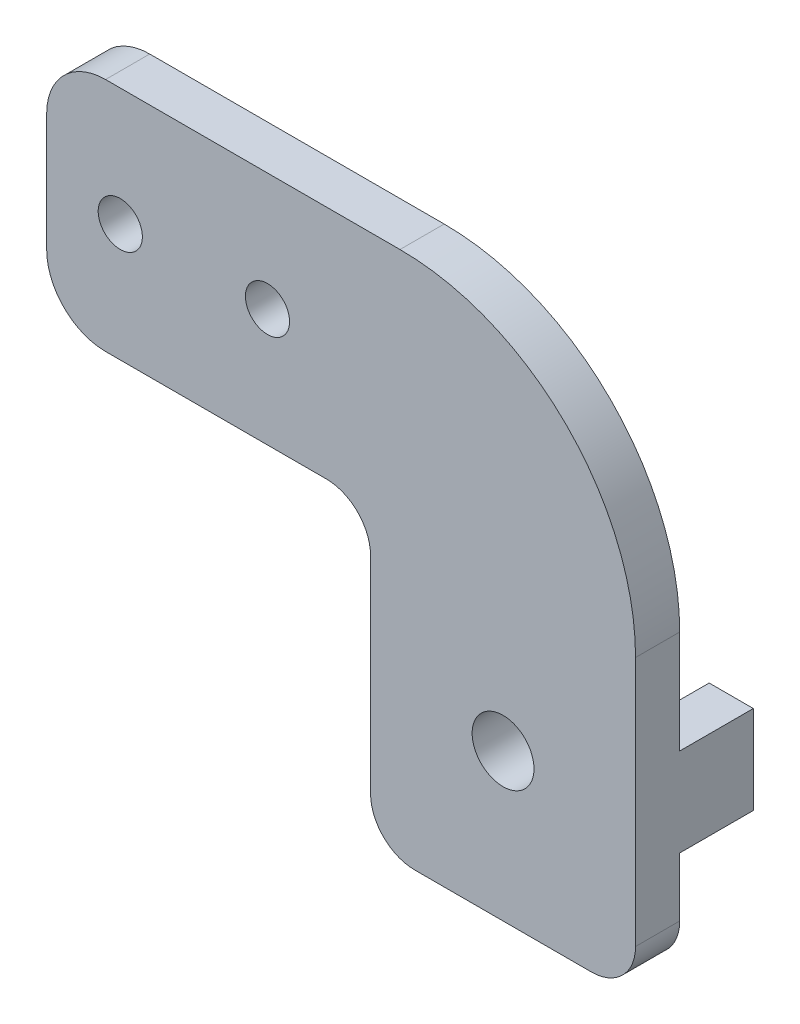
ISO-10303-21;
HEADER;
FILE_DESCRIPTION(('STEP AP214'),'2;1');
FILE_NAME('part.step','',(''),(''),'','','');
FILE_SCHEMA(('AUTOMOTIVE_DESIGN { 1 0 10303 214 1 1 1 1 }'));
ENDSEC;
DATA;
#1=APPLICATION_CONTEXT('core data for automotive mechanical design processes');
#2=APPLICATION_PROTOCOL_DEFINITION('international standard','automotive_design',2000,#1);
#3=PRODUCT_CONTEXT('',#1,'mechanical');
#4=PRODUCT('Part','Part','',(#3));
#5=PRODUCT_RELATED_PRODUCT_CATEGORY('part','',(#4));
#6=PRODUCT_DEFINITION_FORMATION('','',#4);
#7=PRODUCT_DEFINITION_CONTEXT('part definition',#1,'design');
#8=PRODUCT_DEFINITION('design','',#6,#7);
#9=PRODUCT_DEFINITION_SHAPE('','',#8);
#10=(LENGTH_UNIT() NAMED_UNIT(*) SI_UNIT(.MILLI.,.METRE.));
#11=(NAMED_UNIT(*) PLANE_ANGLE_UNIT() SI_UNIT($,.RADIAN.));
#12=(NAMED_UNIT(*) SI_UNIT($,.STERADIAN.) SOLID_ANGLE_UNIT());
#13=UNCERTAINTY_MEASURE_WITH_UNIT(LENGTH_MEASURE(1.E-05),#10,'distance_accuracy_value','');
#14=(GEOMETRIC_REPRESENTATION_CONTEXT(3) GLOBAL_UNCERTAINTY_ASSIGNED_CONTEXT((#13)) GLOBAL_UNIT_ASSIGNED_CONTEXT((#10,
#11,#12)) REPRESENTATION_CONTEXT('',''));
#15=CARTESIAN_POINT('',(0.,0.,0.));
#16=DIRECTION('',(0.,0.,1.));
#17=DIRECTION('',(1.,0.,0.));
#18=AXIS2_PLACEMENT_3D('',#15,#16,#17);
#19=CARTESIAN_POINT('',(44.,0.,3.));
#20=DIRECTION('',(1.,0.,0.));
#21=DIRECTION('',(0.,1.,0.));
#22=AXIS2_PLACEMENT_3D('',#19,#20,#21);
#23=PLANE('',#22);
#24=DIRECTION('',(0.,-1.,0.));
#25=VECTOR('',#24,1.);
#26=CARTESIAN_POINT('',(44.,0.,0.));
#27=LINE('',#26,#25);
#28=CARTESIAN_POINT('',(44.,20.,0.));
#29=VERTEX_POINT('',#28);
#30=CARTESIAN_POINT('',(44.,13.,0.));
#31=VERTEX_POINT('',#30);
#32=EDGE_CURVE('E299',#29,#31,#27,.T.);
#33=ORIENTED_EDGE('',*,*,#32,.F.);
#34=DIRECTION('',(0.,0.,-1.));
#35=VECTOR('',#34,1.);
#36=CARTESIAN_POINT('',(44.,20.,3.));
#37=LINE('',#36,#35);
#38=CARTESIAN_POINT('',(44.,20.,3.));
#39=VERTEX_POINT('',#38);
#40=EDGE_CURVE('E11',#39,#29,#37,.T.);
#41=ORIENTED_EDGE('',*,*,#40,.F.);
#42=DIRECTION('',(0.,-1.,0.));
#43=VECTOR('',#42,1.);
#44=CARTESIAN_POINT('',(44.,0.,3.));
#45=LINE('',#44,#43);
#46=CARTESIAN_POINT('',(44.,3.,3.));
#47=VERTEX_POINT('',#46);
#48=EDGE_CURVE('E251',#39,#47,#45,.T.);
#49=ORIENTED_EDGE('',*,*,#48,.T.);
#50=DIRECTION('',(0.,0.,-1.));
#51=VECTOR('',#50,1.);
#52=CARTESIAN_POINT('',(44.,3.,3.));
#53=LINE('',#52,#51);
#54=CARTESIAN_POINT('',(44.,3.,0.));
#55=VERTEX_POINT('',#54);
#56=EDGE_CURVE('E293',#47,#55,#53,.T.);
#57=ORIENTED_EDGE('',*,*,#56,.T.);
#58=CARTESIAN_POINT('',(44.,7.,0.));
#59=VERTEX_POINT('',#58);
#60=EDGE_CURVE('E232',#59,#55,#27,.T.);
#61=ORIENTED_EDGE('',*,*,#60,.F.);
#62=DIRECTION('',(0.,0.,1.));
#63=VECTOR('',#62,1.);
#64=CARTESIAN_POINT('',(44.,7.,-5.));
#65=LINE('',#64,#63);
#66=CARTESIAN_POINT('',(44.,7.,-5.));
#67=VERTEX_POINT('',#66);
#68=EDGE_CURVE('E238',#67,#59,#65,.T.);
#69=ORIENTED_EDGE('',*,*,#68,.F.);
#70=DIRECTION('',(0.,-1.,0.));
#71=VECTOR('',#70,1.);
#72=CARTESIAN_POINT('',(44.,0.,-5.));
#73=LINE('',#72,#71);
#74=CARTESIAN_POINT('',(44.,13.,-5.));
#75=VERTEX_POINT('',#74);
#76=EDGE_CURVE('E217',#75,#67,#73,.T.);
#77=ORIENTED_EDGE('',*,*,#76,.F.);
#78=DIRECTION('',(0.,0.,1.));
#79=VECTOR('',#78,1.);
#80=CARTESIAN_POINT('',(44.,13.,-5.));
#81=LINE('',#80,#79);
#82=EDGE_CURVE('E235',#75,#31,#81,.T.);
#83=ORIENTED_EDGE('',*,*,#82,.T.);
#84=EDGE_LOOP('',(#33,#41,#49,#57,#61,#69,#77,#83));
#85=FACE_BOUND('',#84,.T.);
#86=ADVANCED_FACE('F37',(#85),#23,.T.);
#87=CARTESIAN_POINT('',(28.,20.,3.));
#88=DIRECTION('',(0.,0.,-1.));
#89=DIRECTION('',(-1.,0.,0.));
#90=AXIS2_PLACEMENT_3D('',#87,#88,#89);
#91=CYLINDRICAL_SURFACE('',#90,16.);
#92=CARTESIAN_POINT('',(28.,20.,0.));
#93=DIRECTION('',(0.,0.,1.));
#94=DIRECTION('',(1.,0.,0.));
#95=AXIS2_PLACEMENT_3D('',#92,#93,#94);
#96=CIRCLE('',#95,16.);
#97=CARTESIAN_POINT('',(28.,36.,0.));
#98=VERTEX_POINT('',#97);
#99=EDGE_CURVE('E296',#98,#29,#96,.F.);
#100=ORIENTED_EDGE('',*,*,#99,.F.);
#101=DIRECTION('',(0.,0.,-1.));
#102=VECTOR('',#101,1.);
#103=CARTESIAN_POINT('',(28.,36.,3.));
#104=LINE('',#103,#102);
#105=CARTESIAN_POINT('',(28.,36.,3.));
#106=VERTEX_POINT('',#105);
#107=EDGE_CURVE('E45',#106,#98,#104,.T.);
#108=ORIENTED_EDGE('',*,*,#107,.F.);
#109=CARTESIAN_POINT('',(28.,20.,3.));
#110=DIRECTION('',(0.,0.,1.));
#111=DIRECTION('',(1.,0.,0.));
#112=AXIS2_PLACEMENT_3D('',#109,#110,#111);
#113=CIRCLE('',#112,16.);
#114=EDGE_CURVE('E254',#106,#39,#113,.F.);
#115=ORIENTED_EDGE('',*,*,#114,.T.);
#116=ORIENTED_EDGE('',*,*,#40,.T.);
#117=EDGE_LOOP('',(#100,#108,#115,#116));
#118=FACE_BOUND('',#117,.T.);
#119=ADVANCED_FACE('F367',(#118),#91,.T.);
#120=CARTESIAN_POINT('',(0.,36.,3.));
#121=DIRECTION('',(0.,1.,0.));
#122=DIRECTION('',(-1.,0.,0.));
#123=AXIS2_PLACEMENT_3D('',#120,#121,#122);
#124=PLANE('',#123);
#125=DIRECTION('',(1.,0.,0.));
#126=VECTOR('',#125,1.);
#127=CARTESIAN_POINT('',(0.,36.,0.));
#128=LINE('',#127,#126);
#129=CARTESIAN_POINT('',(8.,36.,0.));
#130=VERTEX_POINT('',#129);
#131=EDGE_CURVE('E357',#130,#98,#128,.T.);
#132=ORIENTED_EDGE('',*,*,#131,.F.);
#133=DIRECTION('',(0.,0.,-1.));
#134=VECTOR('',#133,1.);
#135=CARTESIAN_POINT('',(8.,36.,3.));
#136=LINE('',#135,#134);
#137=CARTESIAN_POINT('',(8.,36.,3.));
#138=VERTEX_POINT('',#137);
#139=EDGE_CURVE('E302',#138,#130,#136,.T.);
#140=ORIENTED_EDGE('',*,*,#139,.F.);
#141=DIRECTION('',(1.,0.,0.));
#142=VECTOR('',#141,1.);
#143=CARTESIAN_POINT('',(0.,36.,3.));
#144=LINE('',#143,#142);
#145=EDGE_CURVE('E258',#138,#106,#144,.T.);
#146=ORIENTED_EDGE('',*,*,#145,.T.);
#147=ORIENTED_EDGE('',*,*,#107,.T.);
#148=EDGE_LOOP('',(#132,#140,#146,#147));
#149=FACE_BOUND('',#148,.T.);
#150=ADVANCED_FACE('F413',(#149),#124,.T.);
#151=CARTESIAN_POINT('',(8.,32.,3.));
#152=DIRECTION('',(0.,0.,-1.));
#153=DIRECTION('',(-1.,0.,0.));
#154=AXIS2_PLACEMENT_3D('',#151,#152,#153);
#155=CYLINDRICAL_SURFACE('',#154,4.);
#156=CARTESIAN_POINT('',(8.,32.,0.));
#157=DIRECTION('',(0.,0.,1.));
#158=DIRECTION('',(1.,0.,0.));
#159=AXIS2_PLACEMENT_3D('',#156,#157,#158);
#160=CIRCLE('',#159,4.);
#161=CARTESIAN_POINT('',(4.,32.,0.));
#162=VERTEX_POINT('',#161);
#163=EDGE_CURVE('E355',#130,#162,#160,.T.);
#164=ORIENTED_EDGE('',*,*,#163,.T.);
#165=DIRECTION('',(0.,0.,-1.));
#166=VECTOR('',#165,1.);
#167=CARTESIAN_POINT('',(4.,32.,3.));
#168=LINE('',#167,#166);
#169=CARTESIAN_POINT('',(4.,32.,3.));
#170=VERTEX_POINT('',#169);
#171=EDGE_CURVE('E304',#170,#162,#168,.T.);
#172=ORIENTED_EDGE('',*,*,#171,.F.);
#173=CARTESIAN_POINT('',(8.,32.,3.));
#174=DIRECTION('',(0.,0.,1.));
#175=DIRECTION('',(1.,0.,0.));
#176=AXIS2_PLACEMENT_3D('',#173,#174,#175);
#177=CIRCLE('',#176,4.);
#178=EDGE_CURVE('E261',#138,#170,#177,.T.);
#179=ORIENTED_EDGE('',*,*,#178,.F.);
#180=ORIENTED_EDGE('',*,*,#139,.T.);
#181=EDGE_LOOP('',(#164,#172,#179,#180));
#182=FACE_BOUND('',#181,.T.);
#183=ADVANCED_FACE('F417',(#182),#155,.T.);
#184=CARTESIAN_POINT('',(4.,0.,3.));
#185=DIRECTION('',(-1.,0.,0.));
#186=DIRECTION('',(0.,0.,1.));
#187=AXIS2_PLACEMENT_3D('',#184,#185,#186);
#188=PLANE('',#187);
#189=DIRECTION('',(0.,1.,0.));
#190=VECTOR('',#189,1.);
#191=CARTESIAN_POINT('',(4.,0.,0.));
#192=LINE('',#191,#190);
#193=CARTESIAN_POINT('',(4.,24.,0.));
#194=VERTEX_POINT('',#193);
#195=EDGE_CURVE('E352',#194,#162,#192,.T.);
#196=ORIENTED_EDGE('',*,*,#195,.F.);
#197=DIRECTION('',(0.,0.,-1.));
#198=VECTOR('',#197,1.);
#199=CARTESIAN_POINT('',(4.,24.,3.));
#200=LINE('',#199,#198);
#201=CARTESIAN_POINT('',(4.,24.,3.));
#202=VERTEX_POINT('',#201);
#203=EDGE_CURVE('E306',#202,#194,#200,.T.);
#204=ORIENTED_EDGE('',*,*,#203,.F.);
#205=DIRECTION('',(0.,1.,0.));
#206=VECTOR('',#205,1.);
#207=CARTESIAN_POINT('',(4.,0.,3.));
#208=LINE('',#207,#206);
#209=EDGE_CURVE('E263',#202,#170,#208,.T.);
#210=ORIENTED_EDGE('',*,*,#209,.T.);
#211=ORIENTED_EDGE('',*,*,#171,.T.);
#212=EDGE_LOOP('',(#196,#204,#210,#211));
#213=FACE_BOUND('',#212,.T.);
#214=ADVANCED_FACE('F423',(#213),#188,.T.);
#215=CARTESIAN_POINT('',(8.,24.,3.));
#216=DIRECTION('',(0.,0.,-1.));
#217=DIRECTION('',(-1.,0.,0.));
#218=AXIS2_PLACEMENT_3D('',#215,#216,#217);
#219=CYLINDRICAL_SURFACE('',#218,4.);
#220=CARTESIAN_POINT('',(8.,24.,0.));
#221=DIRECTION('',(0.,0.,1.));
#222=DIRECTION('',(1.,0.,0.));
#223=AXIS2_PLACEMENT_3D('',#220,#221,#222);
#224=CIRCLE('',#223,4.);
#225=CARTESIAN_POINT('',(8.,20.,0.));
#226=VERTEX_POINT('',#225);
#227=EDGE_CURVE('E349',#226,#194,#224,.F.);
#228=ORIENTED_EDGE('',*,*,#227,.F.);
#229=DIRECTION('',(0.,0.,-1.));
#230=VECTOR('',#229,1.);
#231=CARTESIAN_POINT('',(8.,20.,3.));
#232=LINE('',#231,#230);
#233=CARTESIAN_POINT('',(8.,20.,3.));
#234=VERTEX_POINT('',#233);
#235=EDGE_CURVE('E308',#234,#226,#232,.T.);
#236=ORIENTED_EDGE('',*,*,#235,.F.);
#237=CARTESIAN_POINT('',(8.,24.,3.));
#238=DIRECTION('',(0.,0.,1.));
#239=DIRECTION('',(1.,0.,0.));
#240=AXIS2_PLACEMENT_3D('',#237,#238,#239);
#241=CIRCLE('',#240,4.);
#242=EDGE_CURVE('E266',#234,#202,#241,.F.);
#243=ORIENTED_EDGE('',*,*,#242,.T.);
#244=ORIENTED_EDGE('',*,*,#203,.T.);
#245=EDGE_LOOP('',(#228,#236,#243,#244));
#246=FACE_BOUND('',#245,.T.);
#247=ADVANCED_FACE('F427',(#246),#219,.T.);
#248=CARTESIAN_POINT('',(0.,20.,3.));
#249=DIRECTION('',(0.,-1.,0.));
#250=DIRECTION('',(1.,0.,0.));
#251=AXIS2_PLACEMENT_3D('',#248,#249,#250);
#252=PLANE('',#251);
#253=DIRECTION('',(-1.,0.,0.));
#254=VECTOR('',#253,1.);
#255=CARTESIAN_POINT('',(0.,20.,0.));
#256=LINE('',#255,#254);
#257=CARTESIAN_POINT('',(23.,20.,0.));
#258=VERTEX_POINT('',#257);
#259=EDGE_CURVE('E346',#258,#226,#256,.T.);
#260=ORIENTED_EDGE('',*,*,#259,.F.);
#261=DIRECTION('',(0.,0.,-1.));
#262=VECTOR('',#261,1.);
#263=CARTESIAN_POINT('',(23.,20.,3.));
#264=LINE('',#263,#262);
#265=CARTESIAN_POINT('',(23.,20.,3.));
#266=VERTEX_POINT('',#265);
#267=EDGE_CURVE('E310',#266,#258,#264,.T.);
#268=ORIENTED_EDGE('',*,*,#267,.F.);
#269=DIRECTION('',(-1.,0.,0.));
#270=VECTOR('',#269,1.);
#271=CARTESIAN_POINT('',(0.,20.,3.));
#272=LINE('',#271,#270);
#273=EDGE_CURVE('E269',#266,#234,#272,.T.);
#274=ORIENTED_EDGE('',*,*,#273,.T.);
#275=ORIENTED_EDGE('',*,*,#235,.T.);
#276=EDGE_LOOP('',(#260,#268,#274,#275));
#277=FACE_BOUND('',#276,.T.);
#278=ADVANCED_FACE('F431',(#277),#252,.T.);
#279=CARTESIAN_POINT('',(23.,17.,3.));
#280=DIRECTION('',(0.,0.,-1.));
#281=DIRECTION('',(-1.,0.,0.));
#282=AXIS2_PLACEMENT_3D('',#279,#280,#281);
#283=CYLINDRICAL_SURFACE('',#282,3.);
#284=CARTESIAN_POINT('',(23.,17.,0.));
#285=DIRECTION('',(0.,0.,1.));
#286=DIRECTION('',(1.,0.,0.));
#287=AXIS2_PLACEMENT_3D('',#284,#285,#286);
#288=CIRCLE('',#287,3.);
#289=CARTESIAN_POINT('',(26.,17.,0.));
#290=VERTEX_POINT('',#289);
#291=EDGE_CURVE('E343',#258,#290,#288,.F.);
#292=ORIENTED_EDGE('',*,*,#291,.T.);
#293=DIRECTION('',(0.,0.,-1.));
#294=VECTOR('',#293,1.);
#295=CARTESIAN_POINT('',(26.,17.,3.));
#296=LINE('',#295,#294);
#297=CARTESIAN_POINT('',(26.,17.,3.));
#298=VERTEX_POINT('',#297);
#299=EDGE_CURVE('E312',#298,#290,#296,.T.);
#300=ORIENTED_EDGE('',*,*,#299,.F.);
#301=CARTESIAN_POINT('',(23.,17.,3.));
#302=DIRECTION('',(0.,0.,1.));
#303=DIRECTION('',(1.,0.,0.));
#304=AXIS2_PLACEMENT_3D('',#301,#302,#303);
#305=CIRCLE('',#304,3.);
#306=EDGE_CURVE('E272',#266,#298,#305,.F.);
#307=ORIENTED_EDGE('',*,*,#306,.F.);
#308=ORIENTED_EDGE('',*,*,#267,.T.);
#309=EDGE_LOOP('',(#292,#300,#307,#308));
#310=FACE_BOUND('',#309,.T.);
#311=ADVANCED_FACE('F435',(#310),#283,.F.);
#312=CARTESIAN_POINT('',(26.,0.,3.));
#313=DIRECTION('',(-1.,0.,0.));
#314=DIRECTION('',(0.,0.,1.));
#315=AXIS2_PLACEMENT_3D('',#312,#313,#314);
#316=PLANE('',#315);
#317=DIRECTION('',(0.,1.,0.));
#318=VECTOR('',#317,1.);
#319=CARTESIAN_POINT('',(26.,0.,0.));
#320=LINE('',#319,#318);
#321=CARTESIAN_POINT('',(26.,3.,0.));
#322=VERTEX_POINT('',#321);
#323=CARTESIAN_POINT('',(26.,7.,0.));
#324=VERTEX_POINT('',#323);
#325=EDGE_CURVE('E340',#322,#324,#320,.T.);
#326=ORIENTED_EDGE('',*,*,#325,.F.);
#327=DIRECTION('',(0.,0.,-1.));
#328=VECTOR('',#327,1.);
#329=CARTESIAN_POINT('',(26.,3.,3.));
#330=LINE('',#329,#328);
#331=CARTESIAN_POINT('',(26.,3.,3.));
#332=VERTEX_POINT('',#331);
#333=EDGE_CURVE('E315',#332,#322,#330,.T.);
#334=ORIENTED_EDGE('',*,*,#333,.F.);
#335=DIRECTION('',(0.,1.,0.));
#336=VECTOR('',#335,1.);
#337=CARTESIAN_POINT('',(26.,0.,3.));
#338=LINE('',#337,#336);
#339=EDGE_CURVE('E274',#332,#298,#338,.T.);
#340=ORIENTED_EDGE('',*,*,#339,.T.);
#341=ORIENTED_EDGE('',*,*,#299,.T.);
#342=CARTESIAN_POINT('',(26.,13.,0.));
#343=VERTEX_POINT('',#342);
#344=EDGE_CURVE('E342',#343,#290,#320,.T.);
#345=ORIENTED_EDGE('',*,*,#344,.F.);
#346=DIRECTION('',(0.,0.,1.));
#347=VECTOR('',#346,1.);
#348=CARTESIAN_POINT('',(26.,13.,-5.));
#349=LINE('',#348,#347);
#350=CARTESIAN_POINT('',(26.,13.,-5.));
#351=VERTEX_POINT('',#350);
#352=EDGE_CURVE('E190',#351,#343,#349,.T.);
#353=ORIENTED_EDGE('',*,*,#352,.F.);
#354=DIRECTION('',(0.,1.,0.));
#355=VECTOR('',#354,1.);
#356=CARTESIAN_POINT('',(26.,0.,-5.));
#357=LINE('',#356,#355);
#358=CARTESIAN_POINT('',(26.,7.,-5.));
#359=VERTEX_POINT('',#358);
#360=EDGE_CURVE('E180',#359,#351,#357,.T.);
#361=ORIENTED_EDGE('',*,*,#360,.F.);
#362=DIRECTION('',(0.,0.,1.));
#363=VECTOR('',#362,1.);
#364=CARTESIAN_POINT('',(26.,7.,-5.));
#365=LINE('',#364,#363);
#366=EDGE_CURVE('E206',#359,#324,#365,.T.);
#367=ORIENTED_EDGE('',*,*,#366,.T.);
#368=EDGE_LOOP('',(#326,#334,#340,#341,#345,#353,#361,#367));
#369=FACE_BOUND('',#368,.T.);
#370=ADVANCED_FACE('F396',(#369),#316,.T.);
#371=CARTESIAN_POINT('',(29.,3.,3.));
#372=DIRECTION('',(0.,0.,-1.));
#373=DIRECTION('',(-1.,0.,0.));
#374=AXIS2_PLACEMENT_3D('',#371,#372,#373);
#375=CYLINDRICAL_SURFACE('',#374,3.);
#376=CARTESIAN_POINT('',(29.,3.,0.));
#377=DIRECTION('',(0.,0.,1.));
#378=DIRECTION('',(1.,0.,0.));
#379=AXIS2_PLACEMENT_3D('',#376,#377,#378);
#380=CIRCLE('',#379,3.);
#381=CARTESIAN_POINT('',(29.,0.,0.));
#382=VERTEX_POINT('',#381);
#383=EDGE_CURVE('E337',#382,#322,#380,.F.);
#384=ORIENTED_EDGE('',*,*,#383,.F.);
#385=DIRECTION('',(0.,0.,-1.));
#386=VECTOR('',#385,1.);
#387=CARTESIAN_POINT('',(29.,0.,3.));
#388=LINE('',#387,#386);
#389=CARTESIAN_POINT('',(29.,0.,3.));
#390=VERTEX_POINT('',#389);
#391=EDGE_CURVE('E317',#390,#382,#388,.T.);
#392=ORIENTED_EDGE('',*,*,#391,.F.);
#393=CARTESIAN_POINT('',(29.,3.,3.));
#394=DIRECTION('',(0.,0.,1.));
#395=DIRECTION('',(1.,0.,0.));
#396=AXIS2_PLACEMENT_3D('',#393,#394,#395);
#397=CIRCLE('',#396,3.);
#398=EDGE_CURVE('E277',#390,#332,#397,.F.);
#399=ORIENTED_EDGE('',*,*,#398,.T.);
#400=ORIENTED_EDGE('',*,*,#333,.T.);
#401=EDGE_LOOP('',(#384,#392,#399,#400));
#402=FACE_BOUND('',#401,.T.);
#403=ADVANCED_FACE('F391',(#402),#375,.T.);
#404=CARTESIAN_POINT('',(0.,0.,3.));
#405=DIRECTION('',(0.,1.,0.));
#406=DIRECTION('',(0.,0.,1.));
#407=AXIS2_PLACEMENT_3D('',#404,#405,#406);
#408=PLANE('',#407);
#409=DIRECTION('',(1.,0.,0.));
#410=VECTOR('',#409,1.);
#411=CARTESIAN_POINT('',(0.,0.,0.));
#412=LINE('',#411,#410);
#413=CARTESIAN_POINT('',(41.,0.,0.));
#414=VERTEX_POINT('',#413);
#415=EDGE_CURVE('E334',#382,#414,#412,.T.);
#416=ORIENTED_EDGE('',*,*,#415,.T.);
#417=DIRECTION('',(0.,0.,-1.));
#418=VECTOR('',#417,1.);
#419=CARTESIAN_POINT('',(41.,0.,3.));
#420=LINE('',#419,#418);
#421=CARTESIAN_POINT('',(41.,0.,3.));
#422=VERTEX_POINT('',#421);
#423=EDGE_CURVE('E319',#422,#414,#420,.T.);
#424=ORIENTED_EDGE('',*,*,#423,.F.);
#425=DIRECTION('',(1.,0.,0.));
#426=VECTOR('',#425,1.);
#427=CARTESIAN_POINT('',(0.,0.,3.));
#428=LINE('',#427,#426);
#429=EDGE_CURVE('E280',#390,#422,#428,.T.);
#430=ORIENTED_EDGE('',*,*,#429,.F.);
#431=ORIENTED_EDGE('',*,*,#391,.T.);
#432=EDGE_LOOP('',(#416,#424,#430,#431));
#433=FACE_BOUND('',#432,.T.);
#434=ADVANCED_FACE('F388',(#433),#408,.F.);
#435=CARTESIAN_POINT('',(9.,27.9999999999999,3.));
#436=DIRECTION('',(0.,0.,-1.));
#437=DIRECTION('',(-1.,0.,0.));
#438=AXIS2_PLACEMENT_3D('',#435,#436,#437);
#439=CYLINDRICAL_SURFACE('',#438,1.5);
#440=CARTESIAN_POINT('',(9.,27.9999999999999,3.));
#441=DIRECTION('',(0.,0.,1.));
#442=DIRECTION('',(1.,0.,0.));
#443=AXIS2_PLACEMENT_3D('',#440,#441,#442);
#444=CIRCLE('',#443,1.5);
#445=CARTESIAN_POINT('',(10.5,27.9999999999999,3.));
#446=VERTEX_POINT('',#445);
#447=EDGE_CURVE('E288',#446,#446,#444,.T.);
#448=ORIENTED_EDGE('',*,*,#447,.T.);
#449=EDGE_LOOP('',(#448));
#450=FACE_BOUND('',#449,.T.);
#451=CARTESIAN_POINT('',(9.,27.9999999999999,0.));
#452=DIRECTION('',(0.,0.,1.));
#453=DIRECTION('',(1.,0.,0.));
#454=AXIS2_PLACEMENT_3D('',#451,#452,#453);
#455=CIRCLE('',#454,1.5);
#456=CARTESIAN_POINT('',(10.5,27.9999999999999,0.));
#457=VERTEX_POINT('',#456);
#458=EDGE_CURVE('E325',#457,#457,#455,.T.);
#459=ORIENTED_EDGE('',*,*,#458,.F.);
#460=EDGE_LOOP('',(#459));
#461=FACE_BOUND('',#460,.T.);
#462=ADVANCED_FACE('F446',(#450,#461),#439,.F.);
#463=CARTESIAN_POINT('',(19.,27.9999999999999,3.));
#464=DIRECTION('',(0.,0.,-1.));
#465=DIRECTION('',(-1.,0.,0.));
#466=AXIS2_PLACEMENT_3D('',#463,#464,#465);
#467=CYLINDRICAL_SURFACE('',#466,1.5);
#468=CARTESIAN_POINT('',(19.,27.9999999999999,3.));
#469=DIRECTION('',(0.,0.,1.));
#470=DIRECTION('',(1.,0.,0.));
#471=AXIS2_PLACEMENT_3D('',#468,#469,#470);
#472=CIRCLE('',#471,1.5);
#473=CARTESIAN_POINT('',(20.5,27.9999999999999,3.));
#474=VERTEX_POINT('',#473);
#475=EDGE_CURVE('E285',#474,#474,#472,.F.);
#476=ORIENTED_EDGE('',*,*,#475,.F.);
#477=EDGE_LOOP('',(#476));
#478=FACE_BOUND('',#477,.T.);
#479=CARTESIAN_POINT('',(19.,27.9999999999999,0.));
#480=DIRECTION('',(0.,0.,1.));
#481=DIRECTION('',(1.,0.,0.));
#482=AXIS2_PLACEMENT_3D('',#479,#480,#481);
#483=CIRCLE('',#482,1.5);
#484=CARTESIAN_POINT('',(20.5,27.9999999999999,0.));
#485=VERTEX_POINT('',#484);
#486=EDGE_CURVE('E328',#485,#485,#483,.F.);
#487=ORIENTED_EDGE('',*,*,#486,.T.);
#488=EDGE_LOOP('',(#487));
#489=FACE_BOUND('',#488,.T.);
#490=ADVANCED_FACE('F450',(#478,#489),#467,.F.);
#491=CARTESIAN_POINT('',(41.,3.,3.));
#492=DIRECTION('',(0.,0.,-1.));
#493=DIRECTION('',(-1.,0.,0.));
#494=AXIS2_PLACEMENT_3D('',#491,#492,#493);
#495=CYLINDRICAL_SURFACE('',#494,3.);
#496=CARTESIAN_POINT('',(41.,3.,0.));
#497=DIRECTION('',(0.,0.,1.));
#498=DIRECTION('',(1.,0.,0.));
#499=AXIS2_PLACEMENT_3D('',#496,#497,#498);
#500=CIRCLE('',#499,3.);
#501=EDGE_CURVE('E331',#55,#414,#500,.F.);
#502=ORIENTED_EDGE('',*,*,#501,.F.);
#503=ORIENTED_EDGE('',*,*,#56,.F.);
#504=CARTESIAN_POINT('',(41.,3.,3.));
#505=DIRECTION('',(0.,0.,1.));
#506=DIRECTION('',(1.,0.,0.));
#507=AXIS2_PLACEMENT_3D('',#504,#505,#506);
#508=CIRCLE('',#507,3.);
#509=EDGE_CURVE('E282',#47,#422,#508,.F.);
#510=ORIENTED_EDGE('',*,*,#509,.T.);
#511=ORIENTED_EDGE('',*,*,#423,.T.);
#512=EDGE_LOOP('',(#502,#503,#510,#511));
#513=FACE_BOUND('',#512,.T.);
#514=ADVANCED_FACE('F384',(#513),#495,.T.);
#515=CARTESIAN_POINT('',(35.,10.,3.));
#516=DIRECTION('',(0.,0.,-1.));
#517=DIRECTION('',(-1.,0.,0.));
#518=AXIS2_PLACEMENT_3D('',#515,#516,#517);
#519=CYLINDRICAL_SURFACE('',#518,2.1);
#520=CARTESIAN_POINT('',(35.,10.,3.));
#521=DIRECTION('',(0.,0.,1.));
#522=DIRECTION('',(1.,0.,0.));
#523=AXIS2_PLACEMENT_3D('',#520,#521,#522);
#524=CIRCLE('',#523,2.1);
#525=CARTESIAN_POINT('',(37.1,10.,3.));
#526=VERTEX_POINT('',#525);
#527=EDGE_CURVE('E291',#526,#526,#524,.T.);
#528=ORIENTED_EDGE('',*,*,#527,.T.);
#529=EDGE_LOOP('',(#528));
#530=FACE_BOUND('',#529,.T.);
#531=CARTESIAN_POINT('',(35.,10.,0.));
#532=DIRECTION('',(0.,0.,1.));
#533=DIRECTION('',(1.,0.,0.));
#534=AXIS2_PLACEMENT_3D('',#531,#532,#533);
#535=CIRCLE('',#534,2.1);
#536=CARTESIAN_POINT('',(37.1,10.,0.));
#537=VERTEX_POINT('',#536);
#538=EDGE_CURVE('E255',#537,#537,#535,.T.);
#539=ORIENTED_EDGE('',*,*,#538,.F.);
#540=EDGE_LOOP('',(#539));
#541=FACE_BOUND('',#540,.T.);
#542=ADVANCED_FACE('F449',(#530,#541),#519,.F.);
#543=CARTESIAN_POINT('',(0.,0.,3.));
#544=DIRECTION('',(0.,0.,1.));
#545=DIRECTION('',(1.,0.,0.));
#546=AXIS2_PLACEMENT_3D('',#543,#544,#545);
#547=PLANE('',#546);
#548=ORIENTED_EDGE('',*,*,#48,.F.);
#549=ORIENTED_EDGE('',*,*,#114,.F.);
#550=ORIENTED_EDGE('',*,*,#145,.F.);
#551=ORIENTED_EDGE('',*,*,#178,.T.);
#552=ORIENTED_EDGE('',*,*,#209,.F.);
#553=ORIENTED_EDGE('',*,*,#242,.F.);
#554=ORIENTED_EDGE('',*,*,#273,.F.);
#555=ORIENTED_EDGE('',*,*,#306,.T.);
#556=ORIENTED_EDGE('',*,*,#339,.F.);
#557=ORIENTED_EDGE('',*,*,#398,.F.);
#558=ORIENTED_EDGE('',*,*,#429,.T.);
#559=ORIENTED_EDGE('',*,*,#509,.F.);
#560=EDGE_LOOP('',(#548,#549,#550,#551,#552,#553,#554,#555,#556,#557,#558,#559));
#561=FACE_BOUND('',#560,.T.);
#562=ORIENTED_EDGE('',*,*,#475,.T.);
#563=EDGE_LOOP('',(#562));
#564=FACE_BOUND('',#563,.T.);
#565=ORIENTED_EDGE('',*,*,#447,.F.);
#566=EDGE_LOOP('',(#565));
#567=FACE_BOUND('',#566,.T.);
#568=ORIENTED_EDGE('',*,*,#527,.F.);
#569=EDGE_LOOP('',(#568));
#570=FACE_BOUND('',#569,.T.);
#571=ADVANCED_FACE('F459',(#561,#564,#567,#570),#547,.T.);
#572=CARTESIAN_POINT('',(0.,0.,0.));
#573=DIRECTION('',(0.,0.,1.));
#574=DIRECTION('',(1.,0.,0.));
#575=AXIS2_PLACEMENT_3D('',#572,#573,#574);
#576=PLANE('',#575);
#577=ORIENTED_EDGE('',*,*,#325,.T.);
#578=DIRECTION('',(1.,0.,0.));
#579=VECTOR('',#578,1.);
#580=CARTESIAN_POINT('',(0.,7.,0.));
#581=LINE('',#580,#579);
#582=CARTESIAN_POINT('',(29.,7.,0.));
#583=VERTEX_POINT('',#582);
#584=EDGE_CURVE('E53',#324,#583,#581,.T.);
#585=ORIENTED_EDGE('',*,*,#584,.T.);
#586=DIRECTION('',(0.,-1.,0.));
#587=VECTOR('',#586,1.);
#588=CARTESIAN_POINT('',(29.,0.,0.));
#589=LINE('',#588,#587);
#590=CARTESIAN_POINT('',(29.,13.,0.));
#591=VERTEX_POINT('',#590);
#592=EDGE_CURVE('E201',#591,#583,#589,.T.);
#593=ORIENTED_EDGE('',*,*,#592,.F.);
#594=DIRECTION('',(1.,0.,0.));
#595=VECTOR('',#594,1.);
#596=CARTESIAN_POINT('',(0.,13.,0.));
#597=LINE('',#596,#595);
#598=EDGE_CURVE('E59',#343,#591,#597,.T.);
#599=ORIENTED_EDGE('',*,*,#598,.F.);
#600=ORIENTED_EDGE('',*,*,#344,.T.);
#601=ORIENTED_EDGE('',*,*,#291,.F.);
#602=ORIENTED_EDGE('',*,*,#259,.T.);
#603=ORIENTED_EDGE('',*,*,#227,.T.);
#604=ORIENTED_EDGE('',*,*,#195,.T.);
#605=ORIENTED_EDGE('',*,*,#163,.F.);
#606=ORIENTED_EDGE('',*,*,#131,.T.);
#607=ORIENTED_EDGE('',*,*,#99,.T.);
#608=ORIENTED_EDGE('',*,*,#32,.T.);
#609=DIRECTION('',(1.,0.,0.));
#610=VECTOR('',#609,1.);
#611=CARTESIAN_POINT('',(0.,13.,0.));
#612=LINE('',#611,#610);
#613=CARTESIAN_POINT('',(41.,13.,0.));
#614=VERTEX_POINT('',#613);
#615=EDGE_CURVE('E214',#614,#31,#612,.T.);
#616=ORIENTED_EDGE('',*,*,#615,.F.);
#617=DIRECTION('',(0.,-1.,0.));
#618=VECTOR('',#617,1.);
#619=CARTESIAN_POINT('',(41.,0.,0.));
#620=LINE('',#619,#618);
#621=CARTESIAN_POINT('',(41.,7.,0.));
#622=VERTEX_POINT('',#621);
#623=EDGE_CURVE('E205',#614,#622,#620,.T.);
#624=ORIENTED_EDGE('',*,*,#623,.T.);
#625=DIRECTION('',(1.,0.,0.));
#626=VECTOR('',#625,1.);
#627=CARTESIAN_POINT('',(0.,7.,0.));
#628=LINE('',#627,#626);
#629=EDGE_CURVE('E223',#622,#59,#628,.T.);
#630=ORIENTED_EDGE('',*,*,#629,.T.);
#631=ORIENTED_EDGE('',*,*,#60,.T.);
#632=ORIENTED_EDGE('',*,*,#501,.T.);
#633=ORIENTED_EDGE('',*,*,#415,.F.);
#634=ORIENTED_EDGE('',*,*,#383,.T.);
#635=EDGE_LOOP('',(#577,#585,#593,#599,#600,#601,#602,#603,#604,#605,#606,#607,#608,#616,#624,
#630,#631,#632,#633,#634));
#636=FACE_BOUND('',#635,.T.);
#637=ORIENTED_EDGE('',*,*,#486,.F.);
#638=EDGE_LOOP('',(#637));
#639=FACE_BOUND('',#638,.T.);
#640=ORIENTED_EDGE('',*,*,#458,.T.);
#641=EDGE_LOOP('',(#640));
#642=FACE_BOUND('',#641,.T.);
#643=ORIENTED_EDGE('',*,*,#538,.T.);
#644=EDGE_LOOP('',(#643));
#645=FACE_BOUND('',#644,.T.);
#646=ADVANCED_FACE('F363',(#636,#639,#642,#645),#576,.F.);
#647=CARTESIAN_POINT('',(41.,0.,-5.));
#648=DIRECTION('',(-1.,0.,0.));
#649=DIRECTION('',(0.,0.,1.));
#650=AXIS2_PLACEMENT_3D('',#647,#648,#649);
#651=PLANE('',#650);
#652=ORIENTED_EDGE('',*,*,#623,.F.);
#653=DIRECTION('',(0.,0.,1.));
#654=VECTOR('',#653,1.);
#655=CARTESIAN_POINT('',(41.,13.,-5.));
#656=LINE('',#655,#654);
#657=CARTESIAN_POINT('',(41.,13.,-5.));
#658=VERTEX_POINT('',#657);
#659=EDGE_CURVE('E226',#658,#614,#656,.T.);
#660=ORIENTED_EDGE('',*,*,#659,.F.);
#661=DIRECTION('',(0.,-1.,0.));
#662=VECTOR('',#661,1.);
#663=CARTESIAN_POINT('',(41.,0.,-5.));
#664=LINE('',#663,#662);
#665=CARTESIAN_POINT('',(41.,7.,-5.));
#666=VERTEX_POINT('',#665);
#667=EDGE_CURVE('E210',#658,#666,#664,.T.);
#668=ORIENTED_EDGE('',*,*,#667,.T.);
#669=DIRECTION('',(0.,0.,1.));
#670=VECTOR('',#669,1.);
#671=CARTESIAN_POINT('',(41.,7.,-5.));
#672=LINE('',#671,#670);
#673=EDGE_CURVE('E221',#666,#622,#672,.T.);
#674=ORIENTED_EDGE('',*,*,#673,.T.);
#675=EDGE_LOOP('',(#652,#660,#668,#674));
#676=FACE_BOUND('',#675,.T.);
#677=ADVANCED_FACE('F379',(#676),#651,.T.);
#678=CARTESIAN_POINT('',(0.,13.,-5.));
#679=DIRECTION('',(0.,-1.,0.));
#680=DIRECTION('',(0.,0.,-1.));
#681=AXIS2_PLACEMENT_3D('',#678,#679,#680);
#682=PLANE('',#681);
#683=ORIENTED_EDGE('',*,*,#615,.T.);
#684=ORIENTED_EDGE('',*,*,#82,.F.);
#685=DIRECTION('',(1.,0.,0.));
#686=VECTOR('',#685,1.);
#687=CARTESIAN_POINT('',(0.,13.,-5.));
#688=LINE('',#687,#686);
#689=EDGE_CURVE('E219',#658,#75,#688,.T.);
#690=ORIENTED_EDGE('',*,*,#689,.F.);
#691=ORIENTED_EDGE('',*,*,#659,.T.);
#692=EDGE_LOOP('',(#683,#684,#690,#691));
#693=FACE_BOUND('',#692,.T.);
#694=ADVANCED_FACE('F375',(#693),#682,.F.);
#695=CARTESIAN_POINT('',(0.,7.,-5.));
#696=DIRECTION('',(0.,-1.,0.));
#697=DIRECTION('',(0.,0.,-1.));
#698=AXIS2_PLACEMENT_3D('',#695,#696,#697);
#699=PLANE('',#698);
#700=ORIENTED_EDGE('',*,*,#629,.F.);
#701=ORIENTED_EDGE('',*,*,#673,.F.);
#702=DIRECTION('',(1.,0.,0.));
#703=VECTOR('',#702,1.);
#704=CARTESIAN_POINT('',(0.,7.,-5.));
#705=LINE('',#704,#703);
#706=EDGE_CURVE('E213',#666,#67,#705,.T.);
#707=ORIENTED_EDGE('',*,*,#706,.T.);
#708=ORIENTED_EDGE('',*,*,#68,.T.);
#709=EDGE_LOOP('',(#700,#701,#707,#708));
#710=FACE_BOUND('',#709,.T.);
#711=ADVANCED_FACE('F468',(#710),#699,.T.);
#712=CARTESIAN_POINT('',(0.,0.,-5.));
#713=DIRECTION('',(0.,0.,1.));
#714=DIRECTION('',(1.,0.,0.));
#715=AXIS2_PLACEMENT_3D('',#712,#713,#714);
#716=PLANE('',#715);
#717=ORIENTED_EDGE('',*,*,#667,.F.);
#718=ORIENTED_EDGE('',*,*,#689,.T.);
#719=ORIENTED_EDGE('',*,*,#76,.T.);
#720=ORIENTED_EDGE('',*,*,#706,.F.);
#721=EDGE_LOOP('',(#717,#718,#719,#720));
#722=FACE_BOUND('',#721,.T.);
#723=ADVANCED_FACE('F406',(#722),#716,.F.);
#724=CARTESIAN_POINT('',(29.,0.,-5.));
#725=DIRECTION('',(-1.,0.,0.));
#726=DIRECTION('',(0.,0.,1.));
#727=AXIS2_PLACEMENT_3D('',#724,#725,#726);
#728=PLANE('',#727);
#729=ORIENTED_EDGE('',*,*,#592,.T.);
#730=DIRECTION('',(0.,0.,1.));
#731=VECTOR('',#730,1.);
#732=CARTESIAN_POINT('',(29.,7.,-5.));
#733=LINE('',#732,#731);
#734=CARTESIAN_POINT('',(29.,7.,-5.));
#735=VERTEX_POINT('',#734);
#736=EDGE_CURVE('E194',#735,#583,#733,.T.);
#737=ORIENTED_EDGE('',*,*,#736,.F.);
#738=DIRECTION('',(0.,-1.,0.));
#739=VECTOR('',#738,1.);
#740=CARTESIAN_POINT('',(29.,0.,-5.));
#741=LINE('',#740,#739);
#742=CARTESIAN_POINT('',(29.,13.,-5.));
#743=VERTEX_POINT('',#742);
#744=EDGE_CURVE('E177',#743,#735,#741,.T.);
#745=ORIENTED_EDGE('',*,*,#744,.F.);
#746=DIRECTION('',(0.,0.,1.));
#747=VECTOR('',#746,1.);
#748=CARTESIAN_POINT('',(29.,13.,-5.));
#749=LINE('',#748,#747);
#750=EDGE_CURVE('E186',#743,#591,#749,.T.);
#751=ORIENTED_EDGE('',*,*,#750,.T.);
#752=EDGE_LOOP('',(#729,#737,#745,#751));
#753=FACE_BOUND('',#752,.T.);
#754=ADVANCED_FACE('F193',(#753),#728,.F.);
#755=CARTESIAN_POINT('',(0.,7.,-5.));
#756=DIRECTION('',(0.,-1.,0.));
#757=DIRECTION('',(0.,0.,-1.));
#758=AXIS2_PLACEMENT_3D('',#755,#756,#757);
#759=PLANE('',#758);
#760=ORIENTED_EDGE('',*,*,#584,.F.);
#761=ORIENTED_EDGE('',*,*,#366,.F.);
#762=DIRECTION('',(1.,0.,0.));
#763=VECTOR('',#762,1.);
#764=CARTESIAN_POINT('',(0.,7.,-5.));
#765=LINE('',#764,#763);
#766=EDGE_CURVE('E191',#359,#735,#765,.T.);
#767=ORIENTED_EDGE('',*,*,#766,.T.);
#768=ORIENTED_EDGE('',*,*,#736,.T.);
#769=EDGE_LOOP('',(#760,#761,#767,#768));
#770=FACE_BOUND('',#769,.T.);
#771=ADVANCED_FACE('F398',(#770),#759,.T.);
#772=CARTESIAN_POINT('',(0.,13.,-5.));
#773=DIRECTION('',(0.,-1.,0.));
#774=DIRECTION('',(0.,0.,-1.));
#775=AXIS2_PLACEMENT_3D('',#772,#773,#774);
#776=PLANE('',#775);
#777=ORIENTED_EDGE('',*,*,#598,.T.);
#778=ORIENTED_EDGE('',*,*,#750,.F.);
#779=DIRECTION('',(1.,0.,0.));
#780=VECTOR('',#779,1.);
#781=CARTESIAN_POINT('',(0.,13.,-5.));
#782=LINE('',#781,#780);
#783=EDGE_CURVE('E172',#351,#743,#782,.T.);
#784=ORIENTED_EDGE('',*,*,#783,.F.);
#785=ORIENTED_EDGE('',*,*,#352,.T.);
#786=EDGE_LOOP('',(#777,#778,#784,#785));
#787=FACE_BOUND('',#786,.T.);
#788=ADVANCED_FACE('F187',(#787),#776,.F.);
#789=CARTESIAN_POINT('',(0.,0.,-5.));
#790=DIRECTION('',(0.,0.,1.));
#791=DIRECTION('',(1.,0.,0.));
#792=AXIS2_PLACEMENT_3D('',#789,#790,#791);
#793=PLANE('',#792);
#794=ORIENTED_EDGE('',*,*,#744,.T.);
#795=ORIENTED_EDGE('',*,*,#766,.F.);
#796=ORIENTED_EDGE('',*,*,#360,.T.);
#797=ORIENTED_EDGE('',*,*,#783,.T.);
#798=EDGE_LOOP('',(#794,#795,#796,#797));
#799=FACE_BOUND('',#798,.T.);
#800=ADVANCED_FACE('F174',(#799),#793,.F.);
#801=CLOSED_SHELL('',(#86,#119,#150,#183,#214,#247,#278,#311,#370,#403,#434,#462,#490,#514,#542,
#571,#646,#677,#694,#711,#723,#754,#771,#788,#800));
#802=MANIFOLD_SOLID_BREP('B2',#801);
#803=ADVANCED_BREP_SHAPE_REPRESENTATION('',(#18,#802),#14);
#804=SHAPE_DEFINITION_REPRESENTATION(#9,#803);
ENDSEC;
END-ISO-10303-21;
